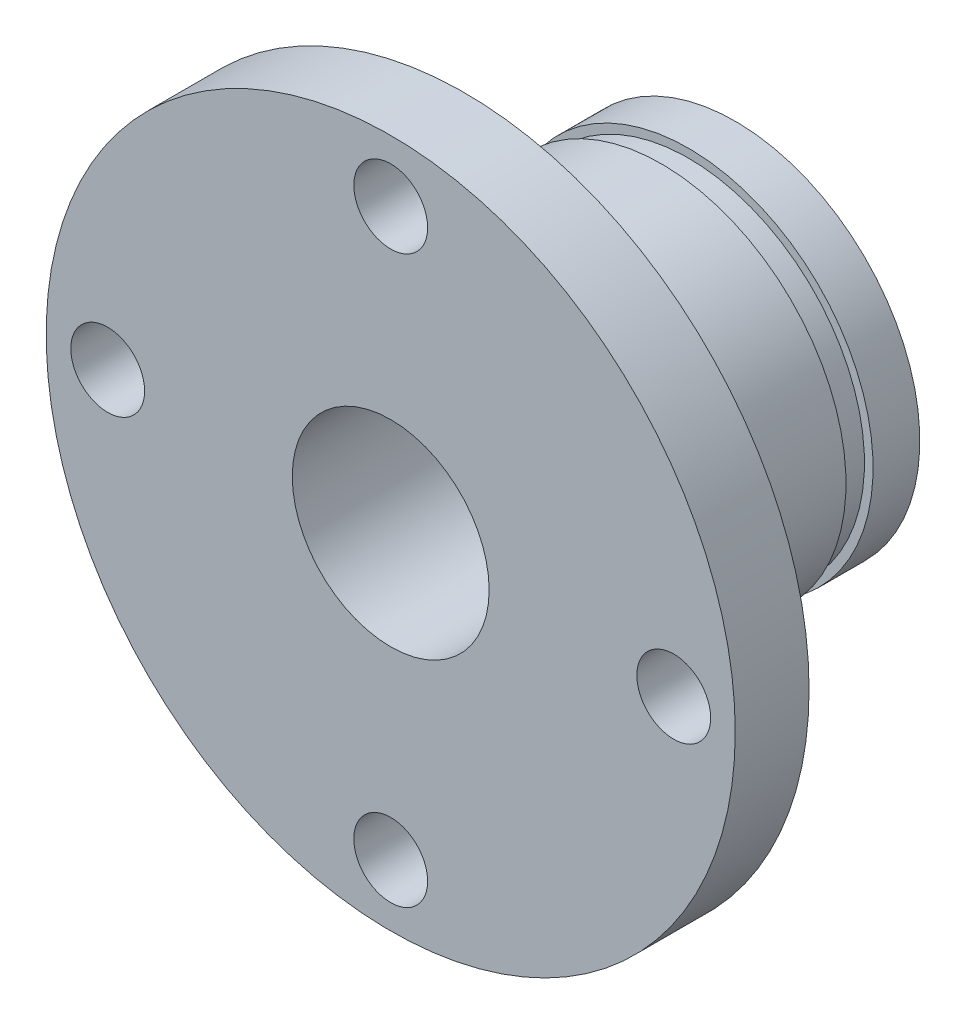
ISO-10303-21;
HEADER;
FILE_DESCRIPTION(('STEP AP214'),'2;1');
FILE_NAME('part.step','',(''),(''),'','','');
FILE_SCHEMA(('AUTOMOTIVE_DESIGN { 1 0 10303 214 1 1 1 1 }'));
ENDSEC;
DATA;
#1=APPLICATION_CONTEXT('core data for automotive mechanical design processes');
#2=APPLICATION_PROTOCOL_DEFINITION('international standard','automotive_design',2000,#1);
#3=PRODUCT_CONTEXT('',#1,'mechanical');
#4=PRODUCT('Part','Part','',(#3));
#5=PRODUCT_RELATED_PRODUCT_CATEGORY('part','',(#4));
#6=PRODUCT_DEFINITION_FORMATION('','',#4);
#7=PRODUCT_DEFINITION_CONTEXT('part definition',#1,'design');
#8=PRODUCT_DEFINITION('design','',#6,#7);
#9=PRODUCT_DEFINITION_SHAPE('','',#8);
#10=(LENGTH_UNIT() NAMED_UNIT(*) SI_UNIT(.MILLI.,.METRE.));
#11=(NAMED_UNIT(*) PLANE_ANGLE_UNIT() SI_UNIT($,.RADIAN.));
#12=(NAMED_UNIT(*) SI_UNIT($,.STERADIAN.) SOLID_ANGLE_UNIT());
#13=UNCERTAINTY_MEASURE_WITH_UNIT(LENGTH_MEASURE(1.E-05),#10,'distance_accuracy_value','');
#14=(GEOMETRIC_REPRESENTATION_CONTEXT(3) GLOBAL_UNCERTAINTY_ASSIGNED_CONTEXT((#13)) GLOBAL_UNIT_ASSIGNED_CONTEXT((#10,
#11,#12)) REPRESENTATION_CONTEXT('',''));
#15=CARTESIAN_POINT('',(0.,0.,0.));
#16=DIRECTION('',(0.,0.,1.));
#17=DIRECTION('',(1.,0.,0.));
#18=AXIS2_PLACEMENT_3D('',#15,#16,#17);
#19=CARTESIAN_POINT('',(0.,0.,-11.));
#20=DIRECTION('',(0.,0.,1.));
#21=DIRECTION('',(1.,0.,0.));
#22=AXIS2_PLACEMENT_3D('',#19,#20,#21);
#23=CYLINDRICAL_SURFACE('',#22,7.5);
#24=CARTESIAN_POINT('',(0.,0.,-1.));
#25=DIRECTION('',(0.,0.,-1.));
#26=DIRECTION('',(-1.,0.,0.));
#27=AXIS2_PLACEMENT_3D('',#24,#25,#26);
#28=CIRCLE('',#27,7.5);
#29=CARTESIAN_POINT('',(-7.5,0.,-1.));
#30=VERTEX_POINT('',#29);
#31=EDGE_CURVE('E47',#30,#30,#28,.T.);
#32=ORIENTED_EDGE('',*,*,#31,.T.);
#33=EDGE_LOOP('',(#32));
#34=FACE_BOUND('',#33,.T.);
#35=CARTESIAN_POINT('',(0.,0.,-8.));
#36=DIRECTION('',(0.,0.,-1.));
#37=DIRECTION('',(-1.,0.,0.));
#38=AXIS2_PLACEMENT_3D('',#35,#36,#37);
#39=CIRCLE('',#38,7.5);
#40=CARTESIAN_POINT('',(-7.5,0.,-8.));
#41=VERTEX_POINT('',#40);
#42=EDGE_CURVE('E96',#41,#41,#39,.T.);
#43=ORIENTED_EDGE('',*,*,#42,.F.);
#44=EDGE_LOOP('',(#43));
#45=FACE_BOUND('',#44,.T.);
#46=ADVANCED_FACE('F35',(#34,#45),#23,.T.);
#47=CARTESIAN_POINT('',(0.,0.,0.));
#48=DIRECTION('',(0.,0.,1.));
#49=DIRECTION('',(1.,0.,0.));
#50=AXIS2_PLACEMENT_3D('',#47,#48,#49);
#51=PLANE('',#50);
#52=CARTESIAN_POINT('',(0.,0.,0.));
#53=DIRECTION('',(0.,0.,1.));
#54=DIRECTION('',(1.,0.,0.));
#55=AXIS2_PLACEMENT_3D('',#52,#53,#54);
#56=CIRCLE('',#55,9.2);
#57=CARTESIAN_POINT('',(9.2,0.,0.));
#58=VERTEX_POINT('',#57);
#59=EDGE_CURVE('E10',#58,#58,#56,.T.);
#60=ORIENTED_EDGE('',*,*,#59,.T.);
#61=EDGE_LOOP('',(#60));
#62=FACE_BOUND('',#61,.T.);
#63=CARTESIAN_POINT('',(-11.4999999999997,-3.12057096504849E-13,0.));
#64=DIRECTION('',(0.,0.,1.));
#65=DIRECTION('',(1.,0.,0.));
#66=AXIS2_PLACEMENT_3D('',#63,#64,#65);
#67=CIRCLE('',#66,1.50000000000067);
#68=CARTESIAN_POINT('',(-9.99999999999902,-3.12057096504849E-13,0.));
#69=VERTEX_POINT('',#68);
#70=EDGE_CURVE('E81',#69,#69,#67,.T.);
#71=ORIENTED_EDGE('',*,*,#70,.T.);
#72=EDGE_LOOP('',(#71));
#73=FACE_BOUND('',#72,.T.);
#74=CARTESIAN_POINT('',(6.21297505371659E-13,-11.5,0.));
#75=DIRECTION('',(0.,0.,1.));
#76=DIRECTION('',(1.,0.,0.));
#77=AXIS2_PLACEMENT_3D('',#74,#75,#76);
#78=CIRCLE('',#77,1.50000000000067);
#79=CARTESIAN_POINT('',(1.50000000000129,-11.5,0.));
#80=VERTEX_POINT('',#79);
#81=EDGE_CURVE('E75',#80,#80,#78,.T.);
#82=ORIENTED_EDGE('',*,*,#81,.T.);
#83=EDGE_LOOP('',(#82));
#84=FACE_BOUND('',#83,.T.);
#85=CARTESIAN_POINT('',(11.5000000000003,3.1064875268583E-13,0.));
#86=DIRECTION('',(0.,0.,1.));
#87=DIRECTION('',(1.,0.,0.));
#88=AXIS2_PLACEMENT_3D('',#85,#86,#87);
#89=CIRCLE('',#88,1.50000000000067);
#90=CARTESIAN_POINT('',(13.000000000001,3.1064875268583E-13,0.));
#91=VERTEX_POINT('',#90);
#92=EDGE_CURVE('E69',#91,#91,#89,.T.);
#93=ORIENTED_EDGE('',*,*,#92,.T.);
#94=EDGE_LOOP('',(#93));
#95=FACE_BOUND('',#94,.T.);
#96=CARTESIAN_POINT('',(0.,11.5,0.));
#97=DIRECTION('',(0.,0.,1.));
#98=DIRECTION('',(1.,0.,0.));
#99=AXIS2_PLACEMENT_3D('',#96,#97,#98);
#100=CIRCLE('',#99,1.50000000000067);
#101=CARTESIAN_POINT('',(1.50000000000067,11.5,0.));
#102=VERTEX_POINT('',#101);
#103=EDGE_CURVE('E63',#102,#102,#100,.T.);
#104=ORIENTED_EDGE('',*,*,#103,.T.);
#105=EDGE_LOOP('',(#104));
#106=FACE_BOUND('',#105,.T.);
#107=CARTESIAN_POINT('',(0.,0.,0.));
#108=DIRECTION('',(0.,0.,1.));
#109=DIRECTION('',(1.,0.,0.));
#110=AXIS2_PLACEMENT_3D('',#107,#108,#109);
#111=CIRCLE('',#110,14.);
#112=CARTESIAN_POINT('',(14.,0.,0.));
#113=VERTEX_POINT('',#112);
#114=EDGE_CURVE('E54',#113,#113,#111,.T.);
#115=ORIENTED_EDGE('',*,*,#114,.F.);
#116=EDGE_LOOP('',(#115));
#117=FACE_BOUND('',#116,.T.);
#118=ADVANCED_FACE('F128',(#62,#73,#84,#95,#106,#117),#51,.F.);
#119=CARTESIAN_POINT('',(0.,0.,3.));
#120=DIRECTION('',(0.,0.,1.));
#121=DIRECTION('',(1.,0.,0.));
#122=AXIS2_PLACEMENT_3D('',#119,#120,#121);
#123=PLANE('',#122);
#124=CARTESIAN_POINT('',(6.21297505371659E-13,-11.5,3.));
#125=DIRECTION('',(0.,0.,1.));
#126=DIRECTION('',(1.,0.,0.));
#127=AXIS2_PLACEMENT_3D('',#124,#125,#126);
#128=CIRCLE('',#127,1.50000000000067);
#129=CARTESIAN_POINT('',(1.50000000000129,-11.5,3.));
#130=VERTEX_POINT('',#129);
#131=EDGE_CURVE('E72',#130,#130,#128,.T.);
#132=ORIENTED_EDGE('',*,*,#131,.F.);
#133=EDGE_LOOP('',(#132));
#134=FACE_BOUND('',#133,.T.);
#135=CARTESIAN_POINT('',(0.,11.5,3.));
#136=DIRECTION('',(0.,0.,1.));
#137=DIRECTION('',(1.,0.,0.));
#138=AXIS2_PLACEMENT_3D('',#135,#136,#137);
#139=CIRCLE('',#138,1.50000000000067);
#140=CARTESIAN_POINT('',(1.50000000000067,11.5,3.));
#141=VERTEX_POINT('',#140);
#142=EDGE_CURVE('E62',#141,#141,#139,.T.);
#143=ORIENTED_EDGE('',*,*,#142,.F.);
#144=EDGE_LOOP('',(#143));
#145=FACE_BOUND('',#144,.T.);
#146=CARTESIAN_POINT('',(0.,0.,3.));
#147=DIRECTION('',(0.,0.,1.));
#148=DIRECTION('',(1.,0.,0.));
#149=AXIS2_PLACEMENT_3D('',#146,#147,#148);
#150=CIRCLE('',#149,14.);
#151=CARTESIAN_POINT('',(14.,0.,3.));
#152=VERTEX_POINT('',#151);
#153=EDGE_CURVE('E51',#152,#152,#150,.T.);
#154=ORIENTED_EDGE('',*,*,#153,.T.);
#155=EDGE_LOOP('',(#154));
#156=FACE_BOUND('',#155,.T.);
#157=CARTESIAN_POINT('',(0.,0.,3.));
#158=DIRECTION('',(0.,0.,1.));
#159=DIRECTION('',(1.,0.,0.));
#160=AXIS2_PLACEMENT_3D('',#157,#158,#159);
#161=CIRCLE('',#160,4.);
#162=CARTESIAN_POINT('',(4.,0.,3.));
#163=VERTEX_POINT('',#162);
#164=EDGE_CURVE('E57',#163,#163,#161,.T.);
#165=ORIENTED_EDGE('',*,*,#164,.F.);
#166=EDGE_LOOP('',(#165));
#167=FACE_BOUND('',#166,.T.);
#168=CARTESIAN_POINT('',(11.5000000000003,3.1064875268583E-13,3.));
#169=DIRECTION('',(0.,0.,1.));
#170=DIRECTION('',(1.,0.,0.));
#171=AXIS2_PLACEMENT_3D('',#168,#169,#170);
#172=CIRCLE('',#171,1.50000000000067);
#173=CARTESIAN_POINT('',(13.000000000001,3.1064875268583E-13,3.));
#174=VERTEX_POINT('',#173);
#175=EDGE_CURVE('E66',#174,#174,#172,.T.);
#176=ORIENTED_EDGE('',*,*,#175,.F.);
#177=EDGE_LOOP('',(#176));
#178=FACE_BOUND('',#177,.T.);
#179=CARTESIAN_POINT('',(-11.4999999999997,-3.12057096504849E-13,3.));
#180=DIRECTION('',(0.,0.,1.));
#181=DIRECTION('',(1.,0.,0.));
#182=AXIS2_PLACEMENT_3D('',#179,#180,#181);
#183=CIRCLE('',#182,1.50000000000067);
#184=CARTESIAN_POINT('',(-9.99999999999902,-3.12057096504849E-13,3.));
#185=VERTEX_POINT('',#184);
#186=EDGE_CURVE('E78',#185,#185,#183,.T.);
#187=ORIENTED_EDGE('',*,*,#186,.F.);
#188=EDGE_LOOP('',(#187));
#189=FACE_BOUND('',#188,.T.);
#190=ADVANCED_FACE('F134',(#134,#145,#156,#167,#178,#189),#123,.T.);
#191=CARTESIAN_POINT('',(0.,0.,3.));
#192=DIRECTION('',(0.,0.,-1.));
#193=DIRECTION('',(-1.,0.,0.));
#194=AXIS2_PLACEMENT_3D('',#191,#192,#193);
#195=CYLINDRICAL_SURFACE('',#194,14.);
#196=ORIENTED_EDGE('',*,*,#153,.F.);
#197=EDGE_LOOP('',(#196));
#198=FACE_BOUND('',#197,.T.);
#199=ORIENTED_EDGE('',*,*,#114,.T.);
#200=EDGE_LOOP('',(#199));
#201=FACE_BOUND('',#200,.T.);
#202=ADVANCED_FACE('F155',(#198,#201),#195,.T.);
#203=CARTESIAN_POINT('',(0.,0.,3.));
#204=DIRECTION('',(0.,0.,-1.));
#205=DIRECTION('',(-1.,0.,0.));
#206=AXIS2_PLACEMENT_3D('',#203,#204,#205);
#207=CYLINDRICAL_SURFACE('',#206,4.);
#208=ORIENTED_EDGE('',*,*,#164,.T.);
#209=EDGE_LOOP('',(#208));
#210=FACE_BOUND('',#209,.T.);
#211=CARTESIAN_POINT('',(0.,0.,-11.));
#212=DIRECTION('',(0.,0.,-1.));
#213=DIRECTION('',(-1.,0.,0.));
#214=AXIS2_PLACEMENT_3D('',#211,#212,#213);
#215=CIRCLE('',#214,4.);
#216=CARTESIAN_POINT('',(-4.,0.,-11.));
#217=VERTEX_POINT('',#216);
#218=EDGE_CURVE('E92',#217,#217,#215,.T.);
#219=ORIENTED_EDGE('',*,*,#218,.T.);
#220=EDGE_LOOP('',(#219));
#221=FACE_BOUND('',#220,.T.);
#222=ADVANCED_FACE('F152',(#210,#221),#207,.F.);
#223=CARTESIAN_POINT('',(0.,11.5,3.));
#224=DIRECTION('',(0.,0.,-1.));
#225=DIRECTION('',(-1.,0.,0.));
#226=AXIS2_PLACEMENT_3D('',#223,#224,#225);
#227=CYLINDRICAL_SURFACE('',#226,1.50000000000067);
#228=ORIENTED_EDGE('',*,*,#142,.T.);
#229=EDGE_LOOP('',(#228));
#230=FACE_BOUND('',#229,.T.);
#231=ORIENTED_EDGE('',*,*,#103,.F.);
#232=EDGE_LOOP('',(#231));
#233=FACE_BOUND('',#232,.T.);
#234=ADVANCED_FACE('F154',(#230,#233),#227,.F.);
#235=CARTESIAN_POINT('',(11.5000000000003,3.1064875268583E-13,3.));
#236=DIRECTION('',(0.,0.,-1.));
#237=DIRECTION('',(-1.,0.,0.));
#238=AXIS2_PLACEMENT_3D('',#235,#236,#237);
#239=CYLINDRICAL_SURFACE('',#238,1.50000000000067);
#240=ORIENTED_EDGE('',*,*,#175,.T.);
#241=EDGE_LOOP('',(#240));
#242=FACE_BOUND('',#241,.T.);
#243=ORIENTED_EDGE('',*,*,#92,.F.);
#244=EDGE_LOOP('',(#243));
#245=FACE_BOUND('',#244,.T.);
#246=ADVANCED_FACE('F162',(#242,#245),#239,.F.);
#247=CARTESIAN_POINT('',(6.21297505371659E-13,-11.5,3.));
#248=DIRECTION('',(0.,0.,-1.));
#249=DIRECTION('',(-1.,0.,0.));
#250=AXIS2_PLACEMENT_3D('',#247,#248,#249);
#251=CYLINDRICAL_SURFACE('',#250,1.50000000000067);
#252=ORIENTED_EDGE('',*,*,#131,.T.);
#253=EDGE_LOOP('',(#252));
#254=FACE_BOUND('',#253,.T.);
#255=ORIENTED_EDGE('',*,*,#81,.F.);
#256=EDGE_LOOP('',(#255));
#257=FACE_BOUND('',#256,.T.);
#258=ADVANCED_FACE('F188',(#254,#257),#251,.F.);
#259=CARTESIAN_POINT('',(-11.4999999999997,-3.12057096504849E-13,3.));
#260=DIRECTION('',(0.,0.,-1.));
#261=DIRECTION('',(-1.,0.,0.));
#262=AXIS2_PLACEMENT_3D('',#259,#260,#261);
#263=CYLINDRICAL_SURFACE('',#262,1.50000000000067);
#264=ORIENTED_EDGE('',*,*,#186,.T.);
#265=EDGE_LOOP('',(#264));
#266=FACE_BOUND('',#265,.T.);
#267=ORIENTED_EDGE('',*,*,#70,.F.);
#268=EDGE_LOOP('',(#267));
#269=FACE_BOUND('',#268,.T.);
#270=ADVANCED_FACE('F184',(#266,#269),#263,.F.);
#271=CARTESIAN_POINT('',(0.,0.,-1.));
#272=DIRECTION('',(0.,0.,-1.));
#273=DIRECTION('',(-1.,0.,0.));
#274=AXIS2_PLACEMENT_3D('',#271,#272,#273);
#275=PLANE('',#274);
#276=ORIENTED_EDGE('',*,*,#31,.F.);
#277=EDGE_LOOP('',(#276));
#278=FACE_BOUND('',#277,.T.);
#279=CARTESIAN_POINT('',(0.,0.,-1.));
#280=DIRECTION('',(0.,0.,-1.));
#281=DIRECTION('',(-1.,0.,0.));
#282=AXIS2_PLACEMENT_3D('',#279,#280,#281);
#283=CIRCLE('',#282,9.);
#284=CARTESIAN_POINT('',(-9.,0.,-1.));
#285=VERTEX_POINT('',#284);
#286=EDGE_CURVE('E84',#285,#285,#283,.T.);
#287=ORIENTED_EDGE('',*,*,#286,.T.);
#288=EDGE_LOOP('',(#287));
#289=FACE_BOUND('',#288,.T.);
#290=ADVANCED_FACE('F187',(#278,#289),#275,.T.);
#291=CARTESIAN_POINT('',(0.,0.,-1.));
#292=DIRECTION('',(0.,0.,1.));
#293=DIRECTION('',(1.,0.,0.));
#294=AXIS2_PLACEMENT_3D('',#291,#292,#293);
#295=CYLINDRICAL_SURFACE('',#294,9.);
#296=CARTESIAN_POINT('',(0.,0.,-0.200000000000004));
#297=DIRECTION('',(0.,0.,1.));
#298=DIRECTION('',(1.,0.,0.));
#299=AXIS2_PLACEMENT_3D('',#296,#297,#298);
#300=CIRCLE('',#299,9.);
#301=CARTESIAN_POINT('',(9.,0.,-0.200000000000004));
#302=VERTEX_POINT('',#301);
#303=EDGE_CURVE('E43',#302,#302,#300,.F.);
#304=ORIENTED_EDGE('',*,*,#303,.T.);
#305=EDGE_LOOP('',(#304));
#306=FACE_BOUND('',#305,.T.);
#307=ORIENTED_EDGE('',*,*,#286,.F.);
#308=EDGE_LOOP('',(#307));
#309=FACE_BOUND('',#308,.T.);
#310=ADVANCED_FACE('F144',(#306,#309),#295,.T.);
#311=CARTESIAN_POINT('',(0.,0.,-11.));
#312=DIRECTION('',(0.,0.,-1.));
#313=DIRECTION('',(-1.,0.,0.));
#314=AXIS2_PLACEMENT_3D('',#311,#312,#313);
#315=PLANE('',#314);
#316=CARTESIAN_POINT('',(0.,0.,-11.));
#317=DIRECTION('',(0.,0.,-1.));
#318=DIRECTION('',(-1.,0.,0.));
#319=AXIS2_PLACEMENT_3D('',#316,#317,#318);
#320=CIRCLE('',#319,7.5);
#321=CARTESIAN_POINT('',(-7.5,0.,-11.));
#322=VERTEX_POINT('',#321);
#323=EDGE_CURVE('E88',#322,#322,#320,.T.);
#324=ORIENTED_EDGE('',*,*,#323,.T.);
#325=EDGE_LOOP('',(#324));
#326=FACE_BOUND('',#325,.T.);
#327=ORIENTED_EDGE('',*,*,#218,.F.);
#328=EDGE_LOOP('',(#327));
#329=FACE_BOUND('',#328,.T.);
#330=ADVANCED_FACE('F139',(#326,#329),#315,.T.);
#331=CARTESIAN_POINT('',(0.,0.,-9.1));
#332=DIRECTION('',(0.,0.,-1.));
#333=DIRECTION('',(-1.,0.,0.));
#334=AXIS2_PLACEMENT_3D('',#331,#332,#333);
#335=CIRCLE('',#334,7.5);
#336=CARTESIAN_POINT('',(-7.5,0.,-9.1));
#337=VERTEX_POINT('',#336);
#338=EDGE_CURVE('E95',#337,#337,#335,.T.);
#339=ORIENTED_EDGE('',*,*,#338,.T.);
#340=EDGE_LOOP('',(#339));
#341=FACE_BOUND('',#340,.T.);
#342=ORIENTED_EDGE('',*,*,#323,.F.);
#343=EDGE_LOOP('',(#342));
#344=FACE_BOUND('',#343,.T.);
#345=ADVANCED_FACE('F123',(#341,#344),#23,.T.);
#346=CARTESIAN_POINT('',(0.,0.,-9.1));
#347=DIRECTION('',(0.,0.,-1.));
#348=DIRECTION('',(-1.,0.,0.));
#349=AXIS2_PLACEMENT_3D('',#346,#347,#348);
#350=PLANE('',#349);
#351=ORIENTED_EDGE('',*,*,#338,.F.);
#352=EDGE_LOOP('',(#351));
#353=FACE_BOUND('',#352,.T.);
#354=CARTESIAN_POINT('',(0.,0.,-9.1));
#355=DIRECTION('',(0.,0.,-1.));
#356=DIRECTION('',(-1.,0.,0.));
#357=AXIS2_PLACEMENT_3D('',#354,#355,#356);
#358=CIRCLE('',#357,7.15);
#359=CARTESIAN_POINT('',(-7.15,0.,-9.1));
#360=VERTEX_POINT('',#359);
#361=EDGE_CURVE('E99',#360,#360,#358,.T.);
#362=ORIENTED_EDGE('',*,*,#361,.T.);
#363=EDGE_LOOP('',(#362));
#364=FACE_BOUND('',#363,.T.);
#365=ADVANCED_FACE('F108',(#353,#364),#350,.F.);
#366=CARTESIAN_POINT('',(0.,0.,-8.));
#367=DIRECTION('',(0.,0.,-1.));
#368=DIRECTION('',(-1.,0.,0.));
#369=AXIS2_PLACEMENT_3D('',#366,#367,#368);
#370=PLANE('',#369);
#371=ORIENTED_EDGE('',*,*,#42,.T.);
#372=EDGE_LOOP('',(#371));
#373=FACE_BOUND('',#372,.T.);
#374=CARTESIAN_POINT('',(0.,0.,-8.));
#375=DIRECTION('',(0.,0.,-1.));
#376=DIRECTION('',(-1.,0.,0.));
#377=AXIS2_PLACEMENT_3D('',#374,#375,#376);
#378=CIRCLE('',#377,7.15);
#379=CARTESIAN_POINT('',(-7.15,0.,-8.));
#380=VERTEX_POINT('',#379);
#381=EDGE_CURVE('E102',#380,#380,#378,.T.);
#382=ORIENTED_EDGE('',*,*,#381,.F.);
#383=EDGE_LOOP('',(#382));
#384=FACE_BOUND('',#383,.T.);
#385=ADVANCED_FACE('F113',(#373,#384),#370,.T.);
#386=CARTESIAN_POINT('',(0.,0.,-9.1));
#387=DIRECTION('',(0.,0.,1.));
#388=DIRECTION('',(1.,0.,0.));
#389=AXIS2_PLACEMENT_3D('',#386,#387,#388);
#390=CYLINDRICAL_SURFACE('',#389,7.15);
#391=ORIENTED_EDGE('',*,*,#361,.F.);
#392=EDGE_LOOP('',(#391));
#393=FACE_BOUND('',#392,.T.);
#394=ORIENTED_EDGE('',*,*,#381,.T.);
#395=EDGE_LOOP('',(#394));
#396=FACE_BOUND('',#395,.T.);
#397=ADVANCED_FACE('F110',(#393,#396),#390,.T.);
#398=CARTESIAN_POINT('',(0.,0.,-0.200000000000004));
#399=DIRECTION('',(0.,0.,1.));
#400=DIRECTION('',(1.,0.,0.));
#401=AXIS2_PLACEMENT_3D('',#398,#399,#400);
#402=CONICAL_SURFACE('',#401,9.,0.785398163397448);
#403=ORIENTED_EDGE('',*,*,#59,.F.);
#404=EDGE_LOOP('',(#403));
#405=FACE_BOUND('',#404,.T.);
#406=ORIENTED_EDGE('',*,*,#303,.F.);
#407=EDGE_LOOP('',(#406));
#408=FACE_BOUND('',#407,.T.);
#409=ADVANCED_FACE('F38',(#405,#408),#402,.T.);
#410=CLOSED_SHELL('',(#46,#118,#190,#202,#222,#234,#246,#258,#270,#290,#310,#330,#345,#365,#385,
#397,#409));
#411=MANIFOLD_SOLID_BREP('B2',#410);
#412=ADVANCED_BREP_SHAPE_REPRESENTATION('',(#18,#411),#14);
#413=SHAPE_DEFINITION_REPRESENTATION(#9,#412);
ENDSEC;
END-ISO-10303-21;
